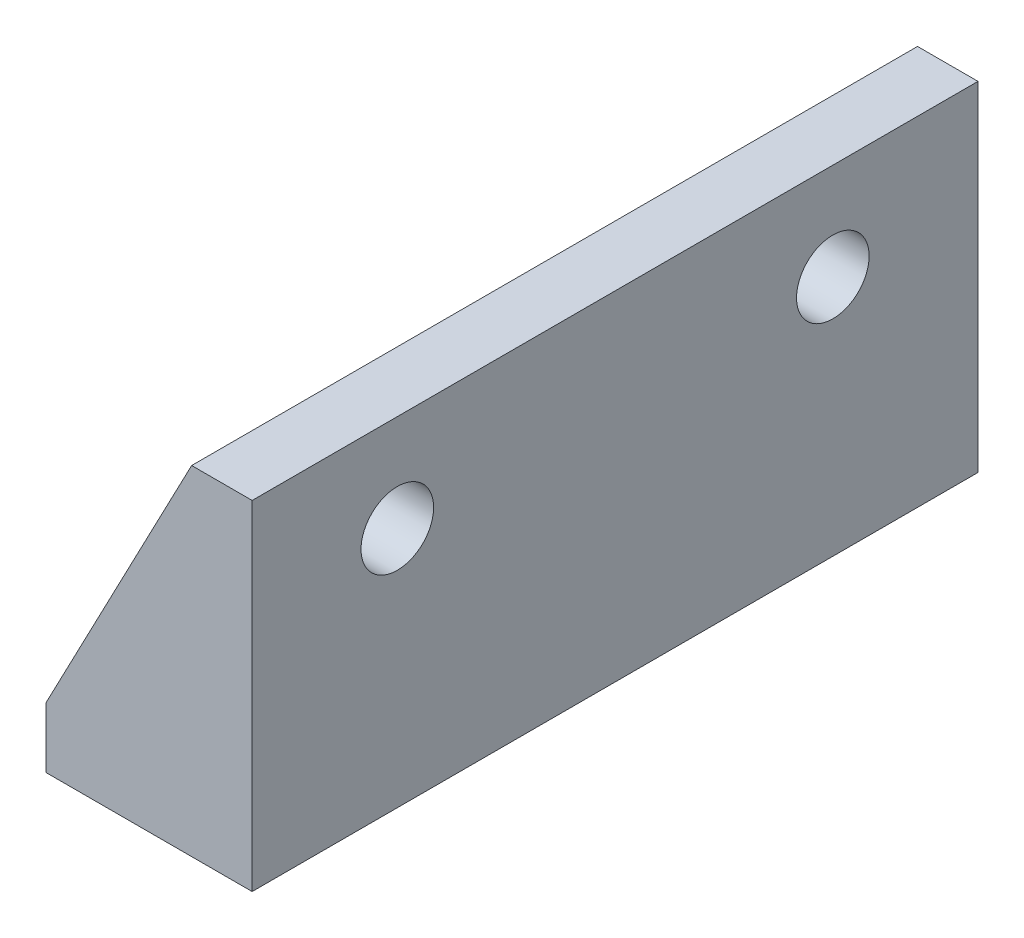
ISO-10303-21;
HEADER;
FILE_DESCRIPTION(('STEP AP214'),'2;1');
FILE_NAME('part.step','',(''),(''),'','','');
FILE_SCHEMA(('AUTOMOTIVE_DESIGN { 1 0 10303 214 1 1 1 1 }'));
ENDSEC;
DATA;
#1=APPLICATION_CONTEXT('core data for automotive mechanical design processes');
#2=APPLICATION_PROTOCOL_DEFINITION('international standard','automotive_design',2000,#1);
#3=PRODUCT_CONTEXT('',#1,'mechanical');
#4=PRODUCT('Part','Part','',(#3));
#5=PRODUCT_RELATED_PRODUCT_CATEGORY('part','',(#4));
#6=PRODUCT_DEFINITION_FORMATION('','',#4);
#7=PRODUCT_DEFINITION_CONTEXT('part definition',#1,'design');
#8=PRODUCT_DEFINITION('design','',#6,#7);
#9=PRODUCT_DEFINITION_SHAPE('','',#8);
#10=(LENGTH_UNIT() NAMED_UNIT(*) SI_UNIT(.MILLI.,.METRE.));
#11=(NAMED_UNIT(*) PLANE_ANGLE_UNIT() SI_UNIT($,.RADIAN.));
#12=(NAMED_UNIT(*) SI_UNIT($,.STERADIAN.) SOLID_ANGLE_UNIT());
#13=UNCERTAINTY_MEASURE_WITH_UNIT(LENGTH_MEASURE(1.E-05),#10,'distance_accuracy_value','');
#14=(GEOMETRIC_REPRESENTATION_CONTEXT(3) GLOBAL_UNCERTAINTY_ASSIGNED_CONTEXT((#13)) GLOBAL_UNIT_ASSIGNED_CONTEXT((#10,
#11,#12)) REPRESENTATION_CONTEXT('',''));
#15=CARTESIAN_POINT('',(0.,0.,0.));
#16=DIRECTION('',(0.,0.,1.));
#17=DIRECTION('',(1.,0.,0.));
#18=AXIS2_PLACEMENT_3D('',#15,#16,#17);
#19=CARTESIAN_POINT('',(0.,2.5,15.));
#20=DIRECTION('',(0.,-1.,0.));
#21=DIRECTION('',(1.,0.,0.));
#22=AXIS2_PLACEMENT_3D('',#19,#20,#21);
#23=PLANE('',#22);
#24=CARTESIAN_POINT('',(-5.52,2.5,0.));
#25=DIRECTION('',(0.,-1.,0.));
#26=DIRECTION('',(1.,0.,0.));
#27=AXIS2_PLACEMENT_3D('',#24,#25,#26);
#28=CIRCLE('',#27,1.5);
#29=CARTESIAN_POINT('',(-4.02,2.5,0.));
#30=VERTEX_POINT('',#29);
#31=EDGE_CURVE('E146',#30,#30,#28,.T.);
#32=ORIENTED_EDGE('',*,*,#31,.T.);
#33=EDGE_LOOP('',(#32));
#34=FACE_BOUND('',#33,.T.);
#35=DIRECTION('',(0.,0.,-1.));
#36=VECTOR('',#35,1.);
#37=CARTESIAN_POINT('',(-8.52,2.5,15.));
#38=LINE('',#37,#36);
#39=CARTESIAN_POINT('',(-8.52,2.5,9.));
#40=VERTEX_POINT('',#39);
#41=CARTESIAN_POINT('',(-8.52,2.5,-9.));
#42=VERTEX_POINT('',#41);
#43=EDGE_CURVE('E161',#40,#42,#38,.T.);
#44=ORIENTED_EDGE('',*,*,#43,.F.);
#45=DIRECTION('',(-1.,0.,0.));
#46=VECTOR('',#45,1.);
#47=CARTESIAN_POINT('',(-2.5,2.5,9.));
#48=LINE('',#47,#46);
#49=CARTESIAN_POINT('',(-2.5,2.5,9.));
#50=VERTEX_POINT('',#49);
#51=EDGE_CURVE('E172',#40,#50,#48,.F.);
#52=ORIENTED_EDGE('',*,*,#51,.T.);
#53=DIRECTION('',(0.,0.,-1.));
#54=VECTOR('',#53,1.);
#55=CARTESIAN_POINT('',(-2.5,2.5,15.));
#56=LINE('',#55,#54);
#57=CARTESIAN_POINT('',(-2.5,2.5,-9.));
#58=VERTEX_POINT('',#57);
#59=EDGE_CURVE('E134',#50,#58,#56,.T.);
#60=ORIENTED_EDGE('',*,*,#59,.T.);
#61=DIRECTION('',(1.,0.,0.));
#62=VECTOR('',#61,1.);
#63=CARTESIAN_POINT('',(-8.52,2.5,-9.));
#64=LINE('',#63,#62);
#65=EDGE_CURVE('E169',#58,#42,#64,.F.);
#66=ORIENTED_EDGE('',*,*,#65,.T.);
#67=EDGE_LOOP('',(#44,#52,#60,#66));
#68=FACE_BOUND('',#67,.T.);
#69=ADVANCED_FACE('F35',(#34,#68),#23,.F.);
#70=CARTESIAN_POINT('',(-2.5,14.,15.));
#71=DIRECTION('',(1.,0.,0.));
#72=DIRECTION('',(0.,0.,-1.));
#73=AXIS2_PLACEMENT_3D('',#70,#71,#72);
#74=PLANE('',#73);
#75=CARTESIAN_POINT('',(-2.5,10.,9.));
#76=DIRECTION('',(1.,0.,0.));
#77=DIRECTION('',(0.,0.,-1.));
#78=AXIS2_PLACEMENT_3D('',#75,#76,#77);
#79=CIRCLE('',#78,1.5);
#80=CARTESIAN_POINT('',(-2.5,10.,7.5));
#81=VERTEX_POINT('',#80);
#82=EDGE_CURVE('E204',#81,#81,#79,.T.);
#83=ORIENTED_EDGE('',*,*,#82,.T.);
#84=EDGE_LOOP('',(#83));
#85=FACE_BOUND('',#84,.T.);
#86=CARTESIAN_POINT('',(-2.5,10.,-9.));
#87=DIRECTION('',(1.,0.,0.));
#88=DIRECTION('',(0.,0.,-1.));
#89=AXIS2_PLACEMENT_3D('',#86,#87,#88);
#90=CIRCLE('',#89,1.5);
#91=CARTESIAN_POINT('',(-2.5,10.,-10.5));
#92=VERTEX_POINT('',#91);
#93=EDGE_CURVE('E210',#92,#92,#90,.T.);
#94=ORIENTED_EDGE('',*,*,#93,.T.);
#95=EDGE_LOOP('',(#94));
#96=FACE_BOUND('',#95,.T.);
#97=ORIENTED_EDGE('',*,*,#59,.F.);
#98=CARTESIAN_POINT('',(-2.5,5.5,9.));
#99=DIRECTION('',(1.,0.,0.));
#100=DIRECTION('',(0.,0.,-1.));
#101=AXIS2_PLACEMENT_3D('',#98,#99,#100);
#102=CIRCLE('',#101,3.);
#103=CARTESIAN_POINT('',(-2.5,5.5,12.));
#104=VERTEX_POINT('',#103);
#105=EDGE_CURVE('E176',#50,#104,#102,.F.);
#106=ORIENTED_EDGE('',*,*,#105,.T.);
#107=DIRECTION('',(0.,-1.,0.));
#108=VECTOR('',#107,1.);
#109=CARTESIAN_POINT('',(-2.5,14.,12.));
#110=LINE('',#109,#108);
#111=CARTESIAN_POINT('',(-2.5,14.,12.));
#112=VERTEX_POINT('',#111);
#113=EDGE_CURVE('E163',#112,#104,#110,.T.);
#114=ORIENTED_EDGE('',*,*,#113,.F.);
#115=DIRECTION('',(0.,0.,-1.));
#116=VECTOR('',#115,1.);
#117=CARTESIAN_POINT('',(-2.5,14.,15.));
#118=LINE('',#117,#116);
#119=CARTESIAN_POINT('',(-2.5,14.,-12.));
#120=VERTEX_POINT('',#119);
#121=EDGE_CURVE('E126',#112,#120,#118,.T.);
#122=ORIENTED_EDGE('',*,*,#121,.T.);
#123=DIRECTION('',(0.,1.,0.));
#124=VECTOR('',#123,1.);
#125=CARTESIAN_POINT('',(-2.5,14.,-12.));
#126=LINE('',#125,#124);
#127=CARTESIAN_POINT('',(-2.5,5.5,-12.));
#128=VERTEX_POINT('',#127);
#129=EDGE_CURVE('E192',#128,#120,#126,.T.);
#130=ORIENTED_EDGE('',*,*,#129,.F.);
#131=CARTESIAN_POINT('',(-2.5,5.5,-9.));
#132=DIRECTION('',(1.,0.,0.));
#133=DIRECTION('',(0.,0.,-1.));
#134=AXIS2_PLACEMENT_3D('',#131,#132,#133);
#135=CIRCLE('',#134,3.);
#136=EDGE_CURVE('E174',#128,#58,#135,.F.);
#137=ORIENTED_EDGE('',*,*,#136,.T.);
#138=EDGE_LOOP('',(#97,#106,#114,#122,#130,#137));
#139=FACE_BOUND('',#138,.T.);
#140=ADVANCED_FACE('F189',(#85,#96,#139),#74,.F.);
#141=CARTESIAN_POINT('',(-8.52,0.,15.));
#142=DIRECTION('',(-1.,0.,0.));
#143=DIRECTION('',(0.,0.,1.));
#144=AXIS2_PLACEMENT_3D('',#141,#142,#143);
#145=PLANE('',#144);
#146=DIRECTION('',(0.,1.,0.));
#147=VECTOR('',#146,1.);
#148=CARTESIAN_POINT('',(-8.52,0.,-15.));
#149=LINE('',#148,#147);
#150=CARTESIAN_POINT('',(-8.52,0.,-15.));
#151=VERTEX_POINT('',#150);
#152=CARTESIAN_POINT('',(-8.52,2.5,-15.));
#153=VERTEX_POINT('',#152);
#154=EDGE_CURVE('E142',#151,#153,#149,.T.);
#155=ORIENTED_EDGE('',*,*,#154,.F.);
#156=DIRECTION('',(0.,0.,-1.));
#157=VECTOR('',#156,1.);
#158=CARTESIAN_POINT('',(-8.52,0.,15.));
#159=LINE('',#158,#157);
#160=CARTESIAN_POINT('',(-8.52,0.,15.));
#161=VERTEX_POINT('',#160);
#162=EDGE_CURVE('E159',#161,#151,#159,.T.);
#163=ORIENTED_EDGE('',*,*,#162,.F.);
#164=DIRECTION('',(0.,1.,0.));
#165=VECTOR('',#164,1.);
#166=CARTESIAN_POINT('',(-8.52,0.,15.));
#167=LINE('',#166,#165);
#168=CARTESIAN_POINT('',(-8.51999999999999,2.50000000000001,15.));
#169=VERTEX_POINT('',#168);
#170=EDGE_CURVE('E154',#161,#169,#167,.T.);
#171=ORIENTED_EDGE('',*,*,#170,.T.);
#172=EDGE_CURVE('E51',#169,#40,#38,.T.);
#173=ORIENTED_EDGE('',*,*,#172,.T.);
#174=ORIENTED_EDGE('',*,*,#43,.T.);
#175=DIRECTION('',(0.,0.,1.));
#176=VECTOR('',#175,1.);
#177=CARTESIAN_POINT('',(-8.52,2.5,15.));
#178=LINE('',#177,#176);
#179=EDGE_CURVE('E214',#42,#153,#178,.F.);
#180=ORIENTED_EDGE('',*,*,#179,.T.);
#181=EDGE_LOOP('',(#155,#163,#171,#173,#174,#180));
#182=FACE_BOUND('',#181,.T.);
#183=ADVANCED_FACE('F236',(#182),#145,.T.);
#184=CARTESIAN_POINT('',(0.,0.,15.));
#185=DIRECTION('',(0.,-1.,0.));
#186=DIRECTION('',(1.,0.,0.));
#187=AXIS2_PLACEMENT_3D('',#184,#185,#186);
#188=PLANE('',#187);
#189=DIRECTION('',(-1.,0.,0.));
#190=VECTOR('',#189,1.);
#191=CARTESIAN_POINT('',(0.,0.,-15.));
#192=LINE('',#191,#190);
#193=CARTESIAN_POINT('',(0.,0.,-15.));
#194=VERTEX_POINT('',#193);
#195=EDGE_CURVE('E145',#194,#151,#192,.T.);
#196=ORIENTED_EDGE('',*,*,#195,.F.);
#197=DIRECTION('',(0.,0.,-1.));
#198=VECTOR('',#197,1.);
#199=CARTESIAN_POINT('',(0.,0.,15.));
#200=LINE('',#199,#198);
#201=CARTESIAN_POINT('',(0.,0.,15.));
#202=VERTEX_POINT('',#201);
#203=EDGE_CURVE('E157',#202,#194,#200,.T.);
#204=ORIENTED_EDGE('',*,*,#203,.F.);
#205=DIRECTION('',(-1.,0.,0.));
#206=VECTOR('',#205,1.);
#207=CARTESIAN_POINT('',(0.,0.,15.));
#208=LINE('',#207,#206);
#209=EDGE_CURVE('E138',#202,#161,#208,.T.);
#210=ORIENTED_EDGE('',*,*,#209,.T.);
#211=ORIENTED_EDGE('',*,*,#162,.T.);
#212=EDGE_LOOP('',(#196,#204,#210,#211));
#213=FACE_BOUND('',#212,.T.);
#214=CARTESIAN_POINT('',(-5.52,0.,0.));
#215=DIRECTION('',(0.,-1.,0.));
#216=DIRECTION('',(1.,0.,0.));
#217=AXIS2_PLACEMENT_3D('',#214,#215,#216);
#218=CIRCLE('',#217,1.5);
#219=CARTESIAN_POINT('',(-4.02,0.,0.));
#220=VERTEX_POINT('',#219);
#221=EDGE_CURVE('E116',#220,#220,#218,.T.);
#222=ORIENTED_EDGE('',*,*,#221,.F.);
#223=EDGE_LOOP('',(#222));
#224=FACE_BOUND('',#223,.T.);
#225=ADVANCED_FACE('F225',(#213,#224),#188,.T.);
#226=CARTESIAN_POINT('',(0.,14.,15.));
#227=DIRECTION('',(1.,0.,0.));
#228=DIRECTION('',(0.,0.,-1.));
#229=AXIS2_PLACEMENT_3D('',#226,#227,#228);
#230=PLANE('',#229);
#231=CARTESIAN_POINT('',(0.,10.,9.));
#232=DIRECTION('',(1.,0.,0.));
#233=DIRECTION('',(0.,0.,-1.));
#234=AXIS2_PLACEMENT_3D('',#231,#232,#233);
#235=CIRCLE('',#234,1.5);
#236=CARTESIAN_POINT('',(0.,10.,7.5));
#237=VERTEX_POINT('',#236);
#238=EDGE_CURVE('E294',#237,#237,#235,.T.);
#239=ORIENTED_EDGE('',*,*,#238,.F.);
#240=EDGE_LOOP('',(#239));
#241=FACE_BOUND('',#240,.T.);
#242=CARTESIAN_POINT('',(0.,10.,-9.));
#243=DIRECTION('',(1.,0.,0.));
#244=DIRECTION('',(0.,0.,1.));
#245=AXIS2_PLACEMENT_3D('',#242,#243,#244);
#246=CIRCLE('',#245,1.5);
#247=CARTESIAN_POINT('',(0.,10.,-7.5));
#248=VERTEX_POINT('',#247);
#249=EDGE_CURVE('E297',#248,#248,#246,.T.);
#250=ORIENTED_EDGE('',*,*,#249,.F.);
#251=EDGE_LOOP('',(#250));
#252=FACE_BOUND('',#251,.T.);
#253=DIRECTION('',(0.,-1.,0.));
#254=VECTOR('',#253,1.);
#255=CARTESIAN_POINT('',(0.,14.,-15.));
#256=LINE('',#255,#254);
#257=CARTESIAN_POINT('',(0.,14.,-15.));
#258=VERTEX_POINT('',#257);
#259=EDGE_CURVE('E149',#258,#194,#256,.T.);
#260=ORIENTED_EDGE('',*,*,#259,.F.);
#261=DIRECTION('',(0.,0.,-1.));
#262=VECTOR('',#261,1.);
#263=CARTESIAN_POINT('',(0.,14.,15.));
#264=LINE('',#263,#262);
#265=CARTESIAN_POINT('',(0.,14.,15.));
#266=VERTEX_POINT('',#265);
#267=EDGE_CURVE('E127',#266,#258,#264,.T.);
#268=ORIENTED_EDGE('',*,*,#267,.F.);
#269=DIRECTION('',(0.,-1.,0.));
#270=VECTOR('',#269,1.);
#271=CARTESIAN_POINT('',(0.,14.,15.));
#272=LINE('',#271,#270);
#273=EDGE_CURVE('E133',#266,#202,#272,.T.);
#274=ORIENTED_EDGE('',*,*,#273,.T.);
#275=ORIENTED_EDGE('',*,*,#203,.T.);
#276=EDGE_LOOP('',(#260,#268,#274,#275));
#277=FACE_BOUND('',#276,.T.);
#278=ADVANCED_FACE('F230',(#241,#252,#277),#230,.T.);
#279=CARTESIAN_POINT('',(-2.5,14.,15.));
#280=DIRECTION('',(0.,1.,0.));
#281=DIRECTION('',(0.,0.,1.));
#282=AXIS2_PLACEMENT_3D('',#279,#280,#281);
#283=PLANE('',#282);
#284=DIRECTION('',(0.,0.,-1.));
#285=VECTOR('',#284,1.);
#286=CARTESIAN_POINT('',(-2.5,14.,15.));
#287=LINE('',#286,#285);
#288=CARTESIAN_POINT('',(-2.5,14.,-15.));
#289=VERTEX_POINT('',#288);
#290=EDGE_CURVE('E207',#289,#120,#287,.F.);
#291=ORIENTED_EDGE('',*,*,#290,.T.);
#292=ORIENTED_EDGE('',*,*,#121,.F.);
#293=CARTESIAN_POINT('',(-2.5,14.,15.));
#294=VERTEX_POINT('',#293);
#295=EDGE_CURVE('E110',#294,#112,#118,.T.);
#296=ORIENTED_EDGE('',*,*,#295,.F.);
#297=DIRECTION('',(1.,0.,0.));
#298=VECTOR('',#297,1.);
#299=CARTESIAN_POINT('',(-2.5,14.,15.));
#300=LINE('',#299,#298);
#301=EDGE_CURVE('E124',#294,#266,#300,.T.);
#302=ORIENTED_EDGE('',*,*,#301,.T.);
#303=ORIENTED_EDGE('',*,*,#267,.T.);
#304=DIRECTION('',(1.,0.,0.));
#305=VECTOR('',#304,1.);
#306=CARTESIAN_POINT('',(-2.5,14.,-15.));
#307=LINE('',#306,#305);
#308=EDGE_CURVE('E152',#289,#258,#307,.T.);
#309=ORIENTED_EDGE('',*,*,#308,.F.);
#310=EDGE_LOOP('',(#291,#292,#296,#302,#303,#309));
#311=FACE_BOUND('',#310,.T.);
#312=ADVANCED_FACE('F123',(#311),#283,.T.);
#313=CARTESIAN_POINT('',(0.,0.,15.));
#314=DIRECTION('',(0.,0.,-1.));
#315=DIRECTION('',(-1.,0.,0.));
#316=AXIS2_PLACEMENT_3D('',#313,#314,#315);
#317=PLANE('',#316);
#318=DIRECTION('',(-0.463776683525147,-0.885952136302191,0.));
#319=VECTOR('',#318,1.);
#320=CARTESIAN_POINT('',(-2.5,14.,15.));
#321=LINE('',#320,#319);
#322=EDGE_CURVE('E106',#294,#169,#321,.T.);
#323=ORIENTED_EDGE('',*,*,#322,.T.);
#324=ORIENTED_EDGE('',*,*,#170,.F.);
#325=ORIENTED_EDGE('',*,*,#209,.F.);
#326=ORIENTED_EDGE('',*,*,#273,.F.);
#327=ORIENTED_EDGE('',*,*,#301,.F.);
#328=EDGE_LOOP('',(#323,#324,#325,#326,#327));
#329=FACE_BOUND('',#328,.T.);
#330=ADVANCED_FACE('F130',(#329),#317,.F.);
#331=CARTESIAN_POINT('',(0.,0.,-15.));
#332=DIRECTION('',(0.,0.,-1.));
#333=DIRECTION('',(-1.,0.,0.));
#334=AXIS2_PLACEMENT_3D('',#331,#332,#333);
#335=PLANE('',#334);
#336=ORIENTED_EDGE('',*,*,#154,.T.);
#337=DIRECTION('',(-0.463776683525147,-0.885952136302191,0.));
#338=VECTOR('',#337,1.);
#339=CARTESIAN_POINT('',(-2.5,14.,-15.));
#340=LINE('',#339,#338);
#341=EDGE_CURVE('E203',#289,#153,#340,.T.);
#342=ORIENTED_EDGE('',*,*,#341,.F.);
#343=ORIENTED_EDGE('',*,*,#308,.T.);
#344=ORIENTED_EDGE('',*,*,#259,.T.);
#345=ORIENTED_EDGE('',*,*,#195,.T.);
#346=EDGE_LOOP('',(#336,#342,#343,#344,#345));
#347=FACE_BOUND('',#346,.T.);
#348=ADVANCED_FACE('F235',(#347),#335,.T.);
#349=CARTESIAN_POINT('',(-5.52,14.,0.));
#350=DIRECTION('',(0.,-1.,0.));
#351=DIRECTION('',(1.,0.,0.));
#352=AXIS2_PLACEMENT_3D('',#349,#350,#351);
#353=CYLINDRICAL_SURFACE('',#352,1.5);
#354=ORIENTED_EDGE('',*,*,#221,.T.);
#355=EDGE_LOOP('',(#354));
#356=FACE_BOUND('',#355,.T.);
#357=ORIENTED_EDGE('',*,*,#31,.F.);
#358=EDGE_LOOP('',(#357));
#359=FACE_BOUND('',#358,.T.);
#360=ADVANCED_FACE('F275',(#356,#359),#353,.F.);
#361=CARTESIAN_POINT('',(-4.26,7.,12.));
#362=DIRECTION('',(0.,0.,1.));
#363=DIRECTION('',(1.,0.,0.));
#364=AXIS2_PLACEMENT_3D('',#361,#362,#363);
#365=PLANE('',#364);
#366=ORIENTED_EDGE('',*,*,#113,.T.);
#367=DIRECTION('',(-1.,0.,0.));
#368=VECTOR('',#367,1.);
#369=CARTESIAN_POINT('',(-8.52,5.5,12.));
#370=LINE('',#369,#368);
#371=CARTESIAN_POINT('',(-6.9495652173913,5.5,12.));
#372=VERTEX_POINT('',#371);
#373=EDGE_CURVE('E166',#104,#372,#370,.T.);
#374=ORIENTED_EDGE('',*,*,#373,.T.);
#375=DIRECTION('',(-0.463776683525147,-0.885952136302191,0.));
#376=VECTOR('',#375,1.);
#377=CARTESIAN_POINT('',(-2.5,14.,12.));
#378=LINE('',#377,#376);
#379=EDGE_CURVE('E117',#112,#372,#378,.T.);
#380=ORIENTED_EDGE('',*,*,#379,.F.);
#381=EDGE_LOOP('',(#366,#374,#380));
#382=FACE_BOUND('',#381,.T.);
#383=ADVANCED_FACE('F272',(#382),#365,.F.);
#384=CARTESIAN_POINT('',(-2.5,14.,15.));
#385=DIRECTION('',(-0.885952136302191,0.463776683525147,0.));
#386=DIRECTION('',(-0.463776683525147,-0.885952136302191,0.));
#387=AXIS2_PLACEMENT_3D('',#384,#385,#386);
#388=PLANE('',#387);
#389=ORIENTED_EDGE('',*,*,#172,.F.);
#390=ORIENTED_EDGE('',*,*,#322,.F.);
#391=ORIENTED_EDGE('',*,*,#295,.T.);
#392=ORIENTED_EDGE('',*,*,#379,.T.);
#393=CARTESIAN_POINT('',(-6.9495652173913,5.5,9.));
#394=DIRECTION('',(-0.885952136302191,0.463776683525147,0.));
#395=DIRECTION('',(0.463776683525147,0.885952136302191,0.));
#396=AXIS2_PLACEMENT_3D('',#393,#394,#395);
#397=ELLIPSE('',#396,3.38618744407737,3.);
#398=EDGE_CURVE('E44',#372,#40,#397,.F.);
#399=ORIENTED_EDGE('',*,*,#398,.T.);
#400=EDGE_LOOP('',(#389,#390,#391,#392,#399));
#401=FACE_BOUND('',#400,.T.);
#402=ADVANCED_FACE('F108',(#401),#388,.T.);
#403=CARTESIAN_POINT('',(-4.26,7.,-12.));
#404=DIRECTION('',(0.,0.,-1.));
#405=DIRECTION('',(-1.,0.,0.));
#406=AXIS2_PLACEMENT_3D('',#403,#404,#405);
#407=PLANE('',#406);
#408=DIRECTION('',(-0.463776683525147,-0.885952136302191,0.));
#409=VECTOR('',#408,1.);
#410=CARTESIAN_POINT('',(-2.5,14.,-12.));
#411=LINE('',#410,#409);
#412=CARTESIAN_POINT('',(-6.9495652173913,5.5,-12.));
#413=VERTEX_POINT('',#412);
#414=EDGE_CURVE('E200',#120,#413,#411,.T.);
#415=ORIENTED_EDGE('',*,*,#414,.T.);
#416=DIRECTION('',(1.,0.,0.));
#417=VECTOR('',#416,1.);
#418=CARTESIAN_POINT('',(-2.5,5.5,-12.));
#419=LINE('',#418,#417);
#420=EDGE_CURVE('E178',#413,#128,#419,.T.);
#421=ORIENTED_EDGE('',*,*,#420,.T.);
#422=ORIENTED_EDGE('',*,*,#129,.T.);
#423=EDGE_LOOP('',(#415,#421,#422));
#424=FACE_BOUND('',#423,.T.);
#425=ADVANCED_FACE('F198',(#424),#407,.F.);
#426=CARTESIAN_POINT('',(-2.5,14.,-15.));
#427=DIRECTION('',(0.885952136302191,-0.463776683525147,0.));
#428=DIRECTION('',(-0.463776683525147,-0.885952136302191,0.));
#429=AXIS2_PLACEMENT_3D('',#426,#427,#428);
#430=PLANE('',#429);
#431=ORIENTED_EDGE('',*,*,#179,.F.);
#432=CARTESIAN_POINT('',(-6.9495652173913,5.5,-9.));
#433=DIRECTION('',(0.885952136302191,-0.463776683525147,0.));
#434=DIRECTION('',(-0.463776683525147,-0.885952136302191,0.));
#435=AXIS2_PLACEMENT_3D('',#432,#433,#434);
#436=ELLIPSE('',#435,3.38618744407737,3.);
#437=EDGE_CURVE('E11',#42,#413,#436,.T.);
#438=ORIENTED_EDGE('',*,*,#437,.T.);
#439=ORIENTED_EDGE('',*,*,#414,.F.);
#440=ORIENTED_EDGE('',*,*,#290,.F.);
#441=ORIENTED_EDGE('',*,*,#341,.T.);
#442=EDGE_LOOP('',(#431,#438,#439,#440,#441));
#443=FACE_BOUND('',#442,.T.);
#444=ADVANCED_FACE('F234',(#443),#430,.F.);
#445=CARTESIAN_POINT('',(-8.52,10.,-9.));
#446=DIRECTION('',(1.,0.,0.));
#447=DIRECTION('',(0.,0.,-1.));
#448=AXIS2_PLACEMENT_3D('',#445,#446,#447);
#449=CYLINDRICAL_SURFACE('',#448,1.5);
#450=ORIENTED_EDGE('',*,*,#249,.T.);
#451=EDGE_LOOP('',(#450));
#452=FACE_BOUND('',#451,.T.);
#453=ORIENTED_EDGE('',*,*,#93,.F.);
#454=EDGE_LOOP('',(#453));
#455=FACE_BOUND('',#454,.T.);
#456=ADVANCED_FACE('F257',(#452,#455),#449,.F.);
#457=CARTESIAN_POINT('',(-8.52,10.,9.));
#458=DIRECTION('',(1.,0.,0.));
#459=DIRECTION('',(0.,0.,-1.));
#460=AXIS2_PLACEMENT_3D('',#457,#458,#459);
#461=CYLINDRICAL_SURFACE('',#460,1.5);
#462=ORIENTED_EDGE('',*,*,#238,.T.);
#463=EDGE_LOOP('',(#462));
#464=FACE_BOUND('',#463,.T.);
#465=ORIENTED_EDGE('',*,*,#82,.F.);
#466=EDGE_LOOP('',(#465));
#467=FACE_BOUND('',#466,.T.);
#468=ADVANCED_FACE('F252',(#464,#467),#461,.F.);
#469=CARTESIAN_POINT('',(-4.26,5.5,9.));
#470=DIRECTION('',(1.,0.,0.));
#471=DIRECTION('',(0.,1.,0.));
#472=AXIS2_PLACEMENT_3D('',#469,#470,#471);
#473=CYLINDRICAL_SURFACE('',#472,3.);
#474=ORIENTED_EDGE('',*,*,#105,.F.);
#475=ORIENTED_EDGE('',*,*,#51,.F.);
#476=ORIENTED_EDGE('',*,*,#398,.F.);
#477=ORIENTED_EDGE('',*,*,#373,.F.);
#478=EDGE_LOOP('',(#474,#475,#476,#477));
#479=FACE_BOUND('',#478,.T.);
#480=ADVANCED_FACE('F184',(#479),#473,.F.);
#481=CARTESIAN_POINT('',(-4.26,5.5,-9.));
#482=DIRECTION('',(-1.,0.,0.));
#483=DIRECTION('',(0.,-1.,0.));
#484=AXIS2_PLACEMENT_3D('',#481,#482,#483);
#485=CYLINDRICAL_SURFACE('',#484,3.);
#486=ORIENTED_EDGE('',*,*,#437,.F.);
#487=ORIENTED_EDGE('',*,*,#65,.F.);
#488=ORIENTED_EDGE('',*,*,#136,.F.);
#489=ORIENTED_EDGE('',*,*,#420,.F.);
#490=EDGE_LOOP('',(#486,#487,#488,#489));
#491=FACE_BOUND('',#490,.T.);
#492=ADVANCED_FACE('F37',(#491),#485,.F.);
#493=CLOSED_SHELL('',(#69,#140,#183,#225,#278,#312,#330,#348,#360,#383,#402,#425,#444,#456,#468,
#480,#492));
#494=MANIFOLD_SOLID_BREP('B2',#493);
#495=ADVANCED_BREP_SHAPE_REPRESENTATION('',(#18,#494),#14);
#496=SHAPE_DEFINITION_REPRESENTATION(#9,#495);
ENDSEC;
END-ISO-10303-21;
